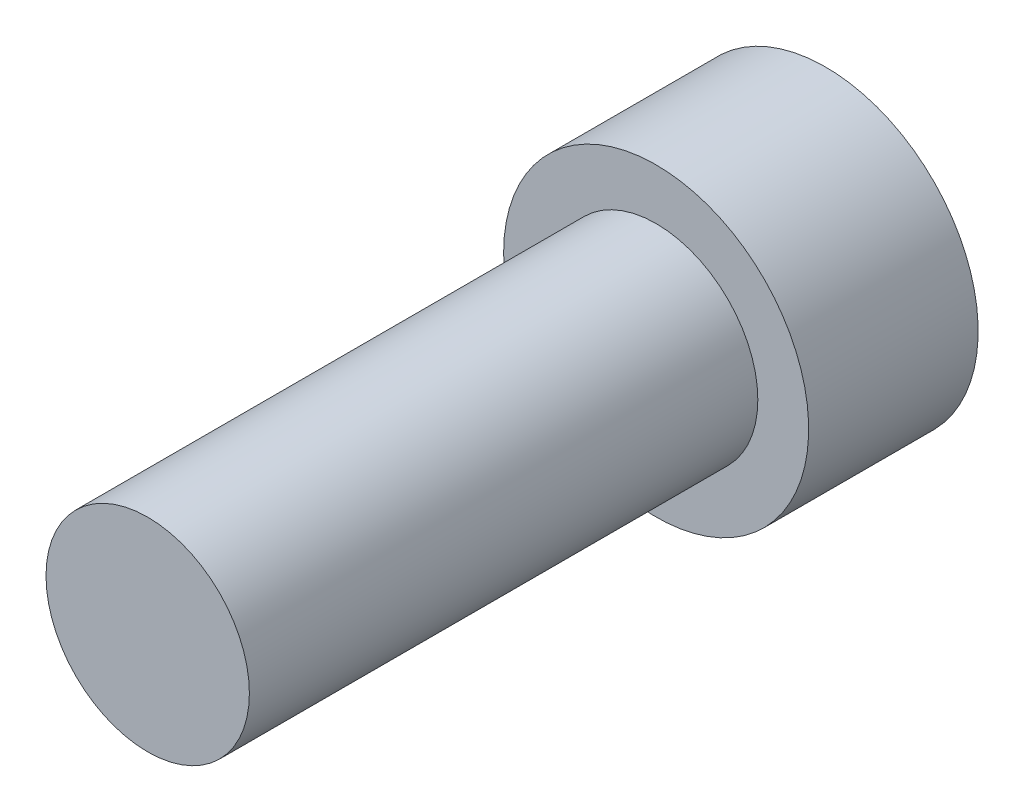
ISO-10303-21;
HEADER;
FILE_DESCRIPTION(('STEP AP214'),'2;1');
FILE_NAME('part.step','',(''),(''),'','','');
FILE_SCHEMA(('AUTOMOTIVE_DESIGN { 1 0 10303 214 1 1 1 1 }'));
ENDSEC;
DATA;
#1=APPLICATION_CONTEXT('core data for automotive mechanical design processes');
#2=APPLICATION_PROTOCOL_DEFINITION('international standard','automotive_design',2000,#1);
#3=PRODUCT_CONTEXT('',#1,'mechanical');
#4=PRODUCT('Part','Part','',(#3));
#5=PRODUCT_RELATED_PRODUCT_CATEGORY('part','',(#4));
#6=PRODUCT_DEFINITION_FORMATION('','',#4);
#7=PRODUCT_DEFINITION_CONTEXT('part definition',#1,'design');
#8=PRODUCT_DEFINITION('design','',#6,#7);
#9=PRODUCT_DEFINITION_SHAPE('','',#8);
#10=(LENGTH_UNIT() NAMED_UNIT(*) SI_UNIT(.MILLI.,.METRE.));
#11=(NAMED_UNIT(*) PLANE_ANGLE_UNIT() SI_UNIT($,.RADIAN.));
#12=(NAMED_UNIT(*) SI_UNIT($,.STERADIAN.) SOLID_ANGLE_UNIT());
#13=UNCERTAINTY_MEASURE_WITH_UNIT(LENGTH_MEASURE(1.E-05),#10,'distance_accuracy_value','');
#14=(GEOMETRIC_REPRESENTATION_CONTEXT(3) GLOBAL_UNCERTAINTY_ASSIGNED_CONTEXT((#13)) GLOBAL_UNIT_ASSIGNED_CONTEXT((#10,
#11,#12)) REPRESENTATION_CONTEXT('',''));
#15=CARTESIAN_POINT('',(0.,0.,0.));
#16=DIRECTION('',(0.,0.,1.));
#17=DIRECTION('',(1.,0.,0.));
#18=AXIS2_PLACEMENT_3D('',#15,#16,#17);
#19=CARTESIAN_POINT('',(0.,0.,-5.));
#20=DIRECTION('',(0.,0.,-1.));
#21=DIRECTION('',(-1.,0.,0.));
#22=AXIS2_PLACEMENT_3D('',#19,#20,#21);
#23=PLANE('',#22);
#24=CARTESIAN_POINT('',(0.,0.,-5.));
#25=DIRECTION('',(0.,0.,-1.));
#26=DIRECTION('',(-1.,0.,0.));
#27=AXIS2_PLACEMENT_3D('',#24,#25,#26);
#28=CIRCLE('',#27,4.5);
#29=CARTESIAN_POINT('',(-4.5,0.,-5.));
#30=VERTEX_POINT('',#29);
#31=EDGE_CURVE('E117',#30,#30,#28,.T.);
#32=ORIENTED_EDGE('',*,*,#31,.T.);
#33=EDGE_LOOP('',(#32));
#34=FACE_BOUND('',#33,.T.);
#35=DIRECTION('',(0.,-1.,0.));
#36=VECTOR('',#35,1.);
#37=CARTESIAN_POINT('',(-3.,1.73205080756888,-5.));
#38=LINE('',#37,#36);
#39=CARTESIAN_POINT('',(-3.,1.73205080756888,-5.));
#40=VERTEX_POINT('',#39);
#41=CARTESIAN_POINT('',(-3.,-1.73205080756888,-5.));
#42=VERTEX_POINT('',#41);
#43=EDGE_CURVE('E101',#40,#42,#38,.T.);
#44=ORIENTED_EDGE('',*,*,#43,.T.);
#45=DIRECTION('',(0.866025403784433,-0.50000000000001,0.));
#46=VECTOR('',#45,1.);
#47=CARTESIAN_POINT('',(-3.00000000000002,-1.73205080756884,-5.));
#48=LINE('',#47,#46);
#49=CARTESIAN_POINT('',(0.,-3.46410161513776,-5.));
#50=VERTEX_POINT('',#49);
#51=EDGE_CURVE('E84',#42,#50,#48,.T.);
#52=ORIENTED_EDGE('',*,*,#51,.T.);
#53=DIRECTION('',(0.866025403784443,0.499999999999992,0.));
#54=VECTOR('',#53,1.);
#55=CARTESIAN_POINT('',(0.,-3.46410161513776,-5.));
#56=LINE('',#55,#54);
#57=CARTESIAN_POINT('',(2.99999999999999,-1.7320508075689,-5.));
#58=VERTEX_POINT('',#57);
#59=EDGE_CURVE('E261',#50,#58,#56,.T.);
#60=ORIENTED_EDGE('',*,*,#59,.T.);
#61=DIRECTION('',(0.,1.,0.));
#62=VECTOR('',#61,1.);
#63=CARTESIAN_POINT('',(2.99999999999999,-1.7320508075689,-5.));
#64=LINE('',#63,#62);
#65=CARTESIAN_POINT('',(3.00000000000001,1.73205080756886,-5.));
#66=VERTEX_POINT('',#65);
#67=EDGE_CURVE('E263',#58,#66,#64,.T.);
#68=ORIENTED_EDGE('',*,*,#67,.T.);
#69=DIRECTION('',(-0.866025403784436,0.500000000000004,0.));
#70=VECTOR('',#69,1.);
#71=CARTESIAN_POINT('',(3.00000000000001,1.73205080756886,-5.));
#72=LINE('',#71,#70);
#73=CARTESIAN_POINT('',(0.,3.46410161513776,-5.));
#74=VERTEX_POINT('',#73);
#75=EDGE_CURVE('E274',#66,#74,#72,.T.);
#76=ORIENTED_EDGE('',*,*,#75,.T.);
#77=DIRECTION('',(-0.86602540378444,-0.499999999999998,0.));
#78=VECTOR('',#77,1.);
#79=CARTESIAN_POINT('',(0.,3.46410161513776,-5.));
#80=LINE('',#79,#78);
#81=EDGE_CURVE('E106',#74,#40,#80,.T.);
#82=ORIENTED_EDGE('',*,*,#81,.T.);
#83=EDGE_LOOP('',(#44,#52,#60,#68,#76,#82));
#84=FACE_BOUND('',#83,.T.);
#85=ADVANCED_FACE('F33',(#34,#84),#23,.T.);
#86=CARTESIAN_POINT('',(-3.,1.73205080756888,-1.));
#87=DIRECTION('',(1.,0.,0.));
#88=DIRECTION('',(0.,0.,-1.));
#89=AXIS2_PLACEMENT_3D('',#86,#87,#88);
#90=PLANE('',#89);
#91=DIRECTION('',(0.,-1.,0.));
#92=VECTOR('',#91,1.);
#93=CARTESIAN_POINT('',(-3.,1.73205080756888,-1.));
#94=LINE('',#93,#92);
#95=CARTESIAN_POINT('',(-3.,1.73205080756888,-1.));
#96=VERTEX_POINT('',#95);
#97=CARTESIAN_POINT('',(-3.,-1.73205080756888,-1.));
#98=VERTEX_POINT('',#97);
#99=EDGE_CURVE('E103',#96,#98,#94,.T.);
#100=ORIENTED_EDGE('',*,*,#99,.T.);
#101=DIRECTION('',(0.,0.,-1.));
#102=VECTOR('',#101,1.);
#103=CARTESIAN_POINT('',(-3.,-1.73205080756888,-1.));
#104=LINE('',#103,#102);
#105=EDGE_CURVE('E88',#98,#42,#104,.T.);
#106=ORIENTED_EDGE('',*,*,#105,.T.);
#107=ORIENTED_EDGE('',*,*,#43,.F.);
#108=DIRECTION('',(0.,0.,-1.));
#109=VECTOR('',#108,1.);
#110=CARTESIAN_POINT('',(-3.,1.73205080756888,-1.));
#111=LINE('',#110,#109);
#112=EDGE_CURVE('E48',#96,#40,#111,.T.);
#113=ORIENTED_EDGE('',*,*,#112,.F.);
#114=EDGE_LOOP('',(#100,#106,#107,#113));
#115=FACE_BOUND('',#114,.T.);
#116=ADVANCED_FACE('F100',(#115),#90,.T.);
#117=CARTESIAN_POINT('',(0.,0.,-1.));
#118=DIRECTION('',(0.,0.,1.));
#119=DIRECTION('',(1.,0.,0.));
#120=AXIS2_PLACEMENT_3D('',#117,#118,#119);
#121=PLANE('',#120);
#122=DIRECTION('',(0.866025403784433,-0.50000000000001,0.));
#123=VECTOR('',#122,1.);
#124=CARTESIAN_POINT('',(-3.00000000000002,-1.73205080756884,-1.));
#125=LINE('',#124,#123);
#126=CARTESIAN_POINT('',(0.,-3.46410161513776,-1.));
#127=VERTEX_POINT('',#126);
#128=EDGE_CURVE('E95',#98,#127,#125,.T.);
#129=ORIENTED_EDGE('',*,*,#128,.F.);
#130=ORIENTED_EDGE('',*,*,#99,.F.);
#131=DIRECTION('',(-0.86602540378444,-0.499999999999998,0.));
#132=VECTOR('',#131,1.);
#133=CARTESIAN_POINT('',(0.,3.46410161513776,-1.));
#134=LINE('',#133,#132);
#135=CARTESIAN_POINT('',(0.,3.46410161513776,-1.));
#136=VERTEX_POINT('',#135);
#137=EDGE_CURVE('E109',#136,#96,#134,.T.);
#138=ORIENTED_EDGE('',*,*,#137,.F.);
#139=DIRECTION('',(-0.866025403784436,0.500000000000004,0.));
#140=VECTOR('',#139,1.);
#141=CARTESIAN_POINT('',(3.00000000000001,1.73205080756886,-1.));
#142=LINE('',#141,#140);
#143=CARTESIAN_POINT('',(3.00000000000001,1.73205080756886,-1.));
#144=VERTEX_POINT('',#143);
#145=EDGE_CURVE('E276',#144,#136,#142,.T.);
#146=ORIENTED_EDGE('',*,*,#145,.F.);
#147=DIRECTION('',(0.,1.,0.));
#148=VECTOR('',#147,1.);
#149=CARTESIAN_POINT('',(2.99999999999999,-1.7320508075689,-1.));
#150=LINE('',#149,#148);
#151=CARTESIAN_POINT('',(2.99999999999999,-1.7320508075689,-1.));
#152=VERTEX_POINT('',#151);
#153=EDGE_CURVE('E270',#152,#144,#150,.T.);
#154=ORIENTED_EDGE('',*,*,#153,.F.);
#155=DIRECTION('',(0.866025403784443,0.499999999999992,0.));
#156=VECTOR('',#155,1.);
#157=CARTESIAN_POINT('',(0.,-3.46410161513776,-1.));
#158=LINE('',#157,#156);
#159=EDGE_CURVE('E257',#127,#152,#158,.T.);
#160=ORIENTED_EDGE('',*,*,#159,.F.);
#161=EDGE_LOOP('',(#129,#130,#138,#146,#154,#160));
#162=FACE_BOUND('',#161,.T.);
#163=ADVANCED_FACE('F141',(#162),#121,.F.);
#164=CARTESIAN_POINT('',(0.,0.,15.));
#165=DIRECTION('',(0.,0.,-1.));
#166=DIRECTION('',(-1.,0.,0.));
#167=AXIS2_PLACEMENT_3D('',#164,#165,#166);
#168=CYLINDRICAL_SURFACE('',#167,3.);
#169=CARTESIAN_POINT('',(0.,0.,15.));
#170=DIRECTION('',(0.,0.,1.));
#171=DIRECTION('',(1.,0.,0.));
#172=AXIS2_PLACEMENT_3D('',#169,#170,#171);
#173=CIRCLE('',#172,3.);
#174=CARTESIAN_POINT('',(3.,0.,15.));
#175=VERTEX_POINT('',#174);
#176=EDGE_CURVE('E11',#175,#175,#173,.T.);
#177=ORIENTED_EDGE('',*,*,#176,.F.);
#178=EDGE_LOOP('',(#177));
#179=FACE_BOUND('',#178,.T.);
#180=CARTESIAN_POINT('',(0.,0.,0.));
#181=DIRECTION('',(0.,0.,1.));
#182=DIRECTION('',(1.,0.,0.));
#183=AXIS2_PLACEMENT_3D('',#180,#181,#182);
#184=CIRCLE('',#183,3.);
#185=CARTESIAN_POINT('',(3.,0.,0.));
#186=VERTEX_POINT('',#185);
#187=EDGE_CURVE('E41',#186,#186,#184,.T.);
#188=ORIENTED_EDGE('',*,*,#187,.T.);
#189=EDGE_LOOP('',(#188));
#190=FACE_BOUND('',#189,.T.);
#191=ADVANCED_FACE('F35',(#179,#190),#168,.T.);
#192=CARTESIAN_POINT('',(0.,0.,15.));
#193=DIRECTION('',(0.,0.,1.));
#194=DIRECTION('',(1.,0.,0.));
#195=AXIS2_PLACEMENT_3D('',#192,#193,#194);
#196=PLANE('',#195);
#197=ORIENTED_EDGE('',*,*,#176,.T.);
#198=EDGE_LOOP('',(#197));
#199=FACE_BOUND('',#198,.T.);
#200=ADVANCED_FACE('F131',(#199),#196,.T.);
#201=CARTESIAN_POINT('',(0.,0.,-5.));
#202=DIRECTION('',(0.,0.,1.));
#203=DIRECTION('',(1.,0.,0.));
#204=AXIS2_PLACEMENT_3D('',#201,#202,#203);
#205=CYLINDRICAL_SURFACE('',#204,4.5);
#206=ORIENTED_EDGE('',*,*,#31,.F.);
#207=EDGE_LOOP('',(#206));
#208=FACE_BOUND('',#207,.T.);
#209=CARTESIAN_POINT('',(0.,0.,0.));
#210=DIRECTION('',(0.,0.,-1.));
#211=DIRECTION('',(-1.,0.,0.));
#212=AXIS2_PLACEMENT_3D('',#209,#210,#211);
#213=CIRCLE('',#212,4.5);
#214=CARTESIAN_POINT('',(-4.5,0.,0.));
#215=VERTEX_POINT('',#214);
#216=EDGE_CURVE('E114',#215,#215,#213,.T.);
#217=ORIENTED_EDGE('',*,*,#216,.T.);
#218=EDGE_LOOP('',(#217));
#219=FACE_BOUND('',#218,.T.);
#220=ADVANCED_FACE('F126',(#208,#219),#205,.T.);
#221=CARTESIAN_POINT('',(0.,0.,0.));
#222=DIRECTION('',(0.,0.,-1.));
#223=DIRECTION('',(-1.,0.,0.));
#224=AXIS2_PLACEMENT_3D('',#221,#222,#223);
#225=PLANE('',#224);
#226=ORIENTED_EDGE('',*,*,#187,.F.);
#227=EDGE_LOOP('',(#226));
#228=FACE_BOUND('',#227,.T.);
#229=ORIENTED_EDGE('',*,*,#216,.F.);
#230=EDGE_LOOP('',(#229));
#231=FACE_BOUND('',#230,.T.);
#232=ADVANCED_FACE('F123',(#228,#231),#225,.F.);
#233=CARTESIAN_POINT('',(-3.00000000000002,-1.73205080756884,-1.));
#234=DIRECTION('',(0.50000000000001,0.866025403784433,0.));
#235=DIRECTION('',(-0.866025403784433,0.50000000000001,0.));
#236=AXIS2_PLACEMENT_3D('',#233,#234,#235);
#237=PLANE('',#236);
#238=ORIENTED_EDGE('',*,*,#128,.T.);
#239=DIRECTION('',(0.,0.,-1.));
#240=VECTOR('',#239,1.);
#241=CARTESIAN_POINT('',(0.,-3.46410161513776,-1.));
#242=LINE('',#241,#240);
#243=EDGE_CURVE('E90',#127,#50,#242,.T.);
#244=ORIENTED_EDGE('',*,*,#243,.T.);
#245=ORIENTED_EDGE('',*,*,#51,.F.);
#246=ORIENTED_EDGE('',*,*,#105,.F.);
#247=EDGE_LOOP('',(#238,#244,#245,#246));
#248=FACE_BOUND('',#247,.T.);
#249=ADVANCED_FACE('F87',(#248),#237,.T.);
#250=CARTESIAN_POINT('',(0.,-3.46410161513776,-1.));
#251=DIRECTION('',(-0.499999999999992,0.866025403784443,0.));
#252=DIRECTION('',(-0.866025403784443,-0.499999999999992,0.));
#253=AXIS2_PLACEMENT_3D('',#250,#251,#252);
#254=PLANE('',#253);
#255=ORIENTED_EDGE('',*,*,#159,.T.);
#256=DIRECTION('',(0.,0.,-1.));
#257=VECTOR('',#256,1.);
#258=CARTESIAN_POINT('',(2.99999999999999,-1.7320508075689,-1.));
#259=LINE('',#258,#257);
#260=EDGE_CURVE('E259',#152,#58,#259,.T.);
#261=ORIENTED_EDGE('',*,*,#260,.T.);
#262=ORIENTED_EDGE('',*,*,#59,.F.);
#263=ORIENTED_EDGE('',*,*,#243,.F.);
#264=EDGE_LOOP('',(#255,#261,#262,#263));
#265=FACE_BOUND('',#264,.T.);
#266=ADVANCED_FACE('F165',(#265),#254,.T.);
#267=CARTESIAN_POINT('',(2.99999999999999,-1.7320508075689,-1.));
#268=DIRECTION('',(-1.,0.,0.));
#269=DIRECTION('',(0.,-1.,0.));
#270=AXIS2_PLACEMENT_3D('',#267,#268,#269);
#271=PLANE('',#270);
#272=ORIENTED_EDGE('',*,*,#153,.T.);
#273=DIRECTION('',(0.,0.,-1.));
#274=VECTOR('',#273,1.);
#275=CARTESIAN_POINT('',(3.00000000000001,1.73205080756886,-1.));
#276=LINE('',#275,#274);
#277=EDGE_CURVE('E278',#144,#66,#276,.T.);
#278=ORIENTED_EDGE('',*,*,#277,.T.);
#279=ORIENTED_EDGE('',*,*,#67,.F.);
#280=ORIENTED_EDGE('',*,*,#260,.F.);
#281=EDGE_LOOP('',(#272,#278,#279,#280));
#282=FACE_BOUND('',#281,.T.);
#283=ADVANCED_FACE('F161',(#282),#271,.T.);
#284=CARTESIAN_POINT('',(3.00000000000001,1.73205080756886,-1.));
#285=DIRECTION('',(-0.500000000000004,-0.866025403784436,0.));
#286=DIRECTION('',(0.866025403784436,-0.500000000000004,0.));
#287=AXIS2_PLACEMENT_3D('',#284,#285,#286);
#288=PLANE('',#287);
#289=ORIENTED_EDGE('',*,*,#145,.T.);
#290=DIRECTION('',(0.,0.,-1.));
#291=VECTOR('',#290,1.);
#292=CARTESIAN_POINT('',(0.,3.46410161513776,-1.));
#293=LINE('',#292,#291);
#294=EDGE_CURVE('E53',#136,#74,#293,.T.);
#295=ORIENTED_EDGE('',*,*,#294,.T.);
#296=ORIENTED_EDGE('',*,*,#75,.F.);
#297=ORIENTED_EDGE('',*,*,#277,.F.);
#298=EDGE_LOOP('',(#289,#295,#296,#297));
#299=FACE_BOUND('',#298,.T.);
#300=ADVANCED_FACE('F158',(#299),#288,.T.);
#301=CARTESIAN_POINT('',(0.,3.46410161513776,-1.));
#302=DIRECTION('',(0.499999999999998,-0.86602540378444,0.));
#303=DIRECTION('',(0.86602540378444,0.499999999999998,0.));
#304=AXIS2_PLACEMENT_3D('',#301,#302,#303);
#305=PLANE('',#304);
#306=ORIENTED_EDGE('',*,*,#137,.T.);
#307=ORIENTED_EDGE('',*,*,#112,.T.);
#308=ORIENTED_EDGE('',*,*,#81,.F.);
#309=ORIENTED_EDGE('',*,*,#294,.F.);
#310=EDGE_LOOP('',(#306,#307,#308,#309));
#311=FACE_BOUND('',#310,.T.);
#312=ADVANCED_FACE('F155',(#311),#305,.T.);
#313=CLOSED_SHELL('',(#85,#116,#163,#191,#200,#220,#232,#249,#266,#283,#300,#312));
#314=MANIFOLD_SOLID_BREP('B2',#313);
#315=ADVANCED_BREP_SHAPE_REPRESENTATION('',(#18,#314),#14);
#316=SHAPE_DEFINITION_REPRESENTATION(#9,#315);
ENDSEC;
END-ISO-10303-21;
